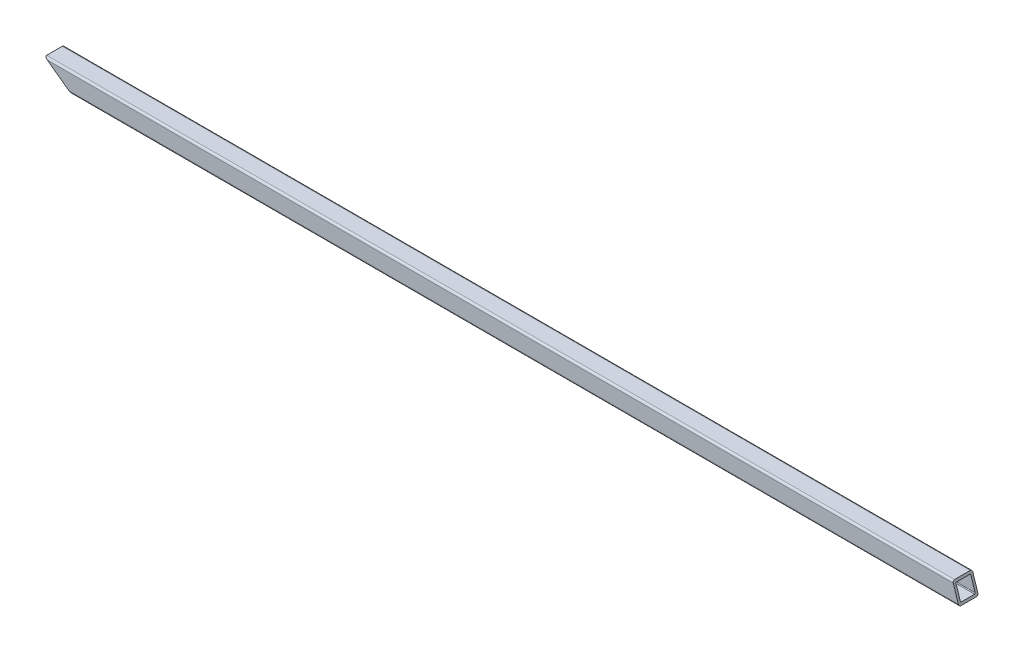
ISO-10303-21;
HEADER;
FILE_DESCRIPTION(('STEP AP214'),'2;1');
FILE_NAME('part.step','',(''),(''),'','','');
FILE_SCHEMA(('AUTOMOTIVE_DESIGN { 1 0 10303 214 1 1 1 1 }'));
ENDSEC;
DATA;
#1=APPLICATION_CONTEXT('core data for automotive mechanical design processes');
#2=APPLICATION_PROTOCOL_DEFINITION('international standard','automotive_design',2000,#1);
#3=PRODUCT_CONTEXT('',#1,'mechanical');
#4=PRODUCT('Part','Part','',(#3));
#5=PRODUCT_RELATED_PRODUCT_CATEGORY('part','',(#4));
#6=PRODUCT_DEFINITION_FORMATION('','',#4);
#7=PRODUCT_DEFINITION_CONTEXT('part definition',#1,'design');
#8=PRODUCT_DEFINITION('design','',#6,#7);
#9=PRODUCT_DEFINITION_SHAPE('','',#8);
#10=(LENGTH_UNIT() NAMED_UNIT(*) SI_UNIT(.MILLI.,.METRE.));
#11=(NAMED_UNIT(*) PLANE_ANGLE_UNIT() SI_UNIT($,.RADIAN.));
#12=(NAMED_UNIT(*) SI_UNIT($,.STERADIAN.) SOLID_ANGLE_UNIT());
#13=UNCERTAINTY_MEASURE_WITH_UNIT(LENGTH_MEASURE(1.E-05),#10,'distance_accuracy_value','');
#14=(GEOMETRIC_REPRESENTATION_CONTEXT(3) GLOBAL_UNCERTAINTY_ASSIGNED_CONTEXT((#13)) GLOBAL_UNIT_ASSIGNED_CONTEXT((#10,
#11,#12)) REPRESENTATION_CONTEXT('',''));
#15=CARTESIAN_POINT('',(0.,0.,0.));
#16=DIRECTION('',(0.,0.,1.));
#17=DIRECTION('',(1.,0.,0.));
#18=AXIS2_PLACEMENT_3D('',#15,#16,#17);
#19=CARTESIAN_POINT('',(-1190.03,12.7,-12.7));
#20=DIRECTION('',(0.,0.,-1.));
#21=DIRECTION('',(0.,1.,0.));
#22=AXIS2_PLACEMENT_3D('',#19,#20,#21);
#23=PLANE('',#22);
#24=DIRECTION('',(-0.309016994374941,0.951056516295156,0.));
#25=VECTOR('',#24,1.);
#26=CARTESIAN_POINT('',(-8.25296028431564,12.7,-12.7));
#27=LINE('',#26,#25);
#28=CARTESIAN_POINT('',(-0.812299240582301,-10.2,-12.7));
#29=VERTEX_POINT('',#28);
#30=CARTESIAN_POINT('',(-7.4406610437334,10.2,-12.7));
#31=VERTEX_POINT('',#30);
#32=EDGE_CURVE('E150',#29,#31,#27,.T.);
#33=ORIENTED_EDGE('',*,*,#32,.F.);
#34=DIRECTION('',(1.,0.,0.));
#35=VECTOR('',#34,1.);
#36=CARTESIAN_POINT('',(-1190.03,-10.2,-12.7));
#37=LINE('',#36,#35);
#38=CARTESIAN_POINT('',(-1158.51085402121,-10.2,-12.7));
#39=VERTEX_POINT('',#38);
#40=EDGE_CURVE('E164',#29,#39,#37,.F.);
#41=ORIENTED_EDGE('',*,*,#40,.T.);
#42=DIRECTION('',(0.809016994374951,-0.587785252292468,0.));
#43=VECTOR('',#42,1.);
#44=CARTESIAN_POINT('',(-1190.03,12.7,-12.7));
#45=LINE('',#44,#43);
#46=CARTESIAN_POINT('',(-1186.58904519882,10.2,-12.7));
#47=VERTEX_POINT('',#46);
#48=EDGE_CURVE('E158',#47,#39,#45,.T.);
#49=ORIENTED_EDGE('',*,*,#48,.F.);
#50=DIRECTION('',(1.,0.,0.));
#51=VECTOR('',#50,1.);
#52=CARTESIAN_POINT('',(-1190.03,10.2,-12.7));
#53=LINE('',#52,#51);
#54=EDGE_CURVE('E167',#47,#31,#53,.T.);
#55=ORIENTED_EDGE('',*,*,#54,.T.);
#56=EDGE_LOOP('',(#33,#41,#49,#55));
#57=FACE_BOUND('',#56,.T.);
#58=ADVANCED_FACE('F37',(#57),#23,.T.);
#59=CARTESIAN_POINT('',(-1190.03,-12.7,12.7));
#60=DIRECTION('',(0.,-1.,0.));
#61=DIRECTION('',(0.,0.,-1.));
#62=AXIS2_PLACEMENT_3D('',#59,#60,#61);
#63=PLANE('',#62);
#64=DIRECTION('',(0.,0.,-1.));
#65=VECTOR('',#64,1.);
#66=CARTESIAN_POINT('',(-1155.06989922003,-12.7,12.7));
#67=LINE('',#66,#65);
#68=CARTESIAN_POINT('',(-1155.06989922003,-12.7,10.2));
#69=VERTEX_POINT('',#68);
#70=CARTESIAN_POINT('',(-1155.06989922003,-12.7,-10.2));
#71=VERTEX_POINT('',#70);
#72=EDGE_CURVE('E244',#69,#71,#67,.T.);
#73=ORIENTED_EDGE('',*,*,#72,.T.);
#74=DIRECTION('',(1.,0.,0.));
#75=VECTOR('',#74,1.);
#76=CARTESIAN_POINT('',(-1190.03,-12.7,-10.2));
#77=LINE('',#76,#75);
#78=CARTESIAN_POINT('',(-1.00180280737661E-13,-12.7,-10.2));
#79=VERTEX_POINT('',#78);
#80=EDGE_CURVE('E181',#71,#79,#77,.T.);
#81=ORIENTED_EDGE('',*,*,#80,.T.);
#82=DIRECTION('',(0.,0.,-1.));
#83=VECTOR('',#82,1.);
#84=CARTESIAN_POINT('',(0.,-12.7,12.7));
#85=LINE('',#84,#83);
#86=CARTESIAN_POINT('',(-1.00180280737661E-13,-12.7,10.2));
#87=VERTEX_POINT('',#86);
#88=EDGE_CURVE('E153',#87,#79,#85,.T.);
#89=ORIENTED_EDGE('',*,*,#88,.F.);
#90=DIRECTION('',(1.,0.,0.));
#91=VECTOR('',#90,1.);
#92=CARTESIAN_POINT('',(-1190.03,-12.7,10.2));
#93=LINE('',#92,#91);
#94=EDGE_CURVE('E268',#87,#69,#93,.F.);
#95=ORIENTED_EDGE('',*,*,#94,.T.);
#96=EDGE_LOOP('',(#73,#81,#89,#95));
#97=FACE_BOUND('',#96,.T.);
#98=ADVANCED_FACE('F274',(#97),#63,.T.);
#99=CARTESIAN_POINT('',(-1190.03,12.7,12.7));
#100=DIRECTION('',(0.,0.,1.));
#101=DIRECTION('',(0.,-1.,0.));
#102=AXIS2_PLACEMENT_3D('',#99,#100,#101);
#103=PLANE('',#102);
#104=DIRECTION('',(-0.309016994374941,0.951056516295156,0.));
#105=VECTOR('',#104,1.);
#106=CARTESIAN_POINT('',(-8.25296028431564,12.7,12.7));
#107=LINE('',#106,#105);
#108=CARTESIAN_POINT('',(-0.812299240582301,-10.2,12.7));
#109=VERTEX_POINT('',#108);
#110=CARTESIAN_POINT('',(-7.44066104373341,10.2,12.7));
#111=VERTEX_POINT('',#110);
#112=EDGE_CURVE('E168',#109,#111,#107,.T.);
#113=ORIENTED_EDGE('',*,*,#112,.T.);
#114=DIRECTION('',(1.,0.,0.));
#115=VECTOR('',#114,1.);
#116=CARTESIAN_POINT('',(-1190.03,10.2,12.7));
#117=LINE('',#116,#115);
#118=CARTESIAN_POINT('',(-1186.58904519882,10.2,12.7));
#119=VERTEX_POINT('',#118);
#120=EDGE_CURVE('E174',#111,#119,#117,.F.);
#121=ORIENTED_EDGE('',*,*,#120,.T.);
#122=DIRECTION('',(0.809016994374951,-0.587785252292468,0.));
#123=VECTOR('',#122,1.);
#124=CARTESIAN_POINT('',(-1190.03,12.7,12.7));
#125=LINE('',#124,#123);
#126=CARTESIAN_POINT('',(-1158.51085402121,-10.2,12.7));
#127=VERTEX_POINT('',#126);
#128=EDGE_CURVE('E278',#119,#127,#125,.T.);
#129=ORIENTED_EDGE('',*,*,#128,.T.);
#130=DIRECTION('',(1.,0.,0.));
#131=VECTOR('',#130,1.);
#132=CARTESIAN_POINT('',(-1190.03,-10.2,12.7));
#133=LINE('',#132,#131);
#134=EDGE_CURVE('E178',#127,#109,#133,.T.);
#135=ORIENTED_EDGE('',*,*,#134,.T.);
#136=EDGE_LOOP('',(#113,#121,#129,#135));
#137=FACE_BOUND('',#136,.T.);
#138=ADVANCED_FACE('F311',(#137),#103,.T.);
#139=CARTESIAN_POINT('',(-1190.03,12.7,12.7));
#140=DIRECTION('',(0.,1.,0.));
#141=DIRECTION('',(0.,0.,1.));
#142=AXIS2_PLACEMENT_3D('',#139,#140,#141);
#143=PLANE('',#142);
#144=DIRECTION('',(0.,0.,-1.));
#145=VECTOR('',#144,1.);
#146=CARTESIAN_POINT('',(-8.25296028431564,12.7,12.7));
#147=LINE('',#146,#145);
#148=CARTESIAN_POINT('',(-8.25296028431555,12.7,10.2));
#149=VERTEX_POINT('',#148);
#150=CARTESIAN_POINT('',(-8.25296028431567,12.7,-10.2));
#151=VERTEX_POINT('',#150);
#152=EDGE_CURVE('E52',#149,#151,#147,.T.);
#153=ORIENTED_EDGE('',*,*,#152,.T.);
#154=DIRECTION('',(1.,0.,0.));
#155=VECTOR('',#154,1.);
#156=CARTESIAN_POINT('',(-1190.03,12.7,-10.2));
#157=LINE('',#156,#155);
#158=CARTESIAN_POINT('',(-1190.03,12.7,-10.2));
#159=VERTEX_POINT('',#158);
#160=EDGE_CURVE('E192',#151,#159,#157,.F.);
#161=ORIENTED_EDGE('',*,*,#160,.T.);
#162=DIRECTION('',(0.,0.,1.));
#163=VECTOR('',#162,1.);
#164=CARTESIAN_POINT('',(-1190.03,12.7,12.7));
#165=LINE('',#164,#163);
#166=CARTESIAN_POINT('',(-1190.03,12.7,10.2));
#167=VERTEX_POINT('',#166);
#168=EDGE_CURVE('E265',#159,#167,#165,.T.);
#169=ORIENTED_EDGE('',*,*,#168,.T.);
#170=DIRECTION('',(1.,0.,0.));
#171=VECTOR('',#170,1.);
#172=CARTESIAN_POINT('',(-1190.03,12.7,10.2));
#173=LINE('',#172,#171);
#174=EDGE_CURVE('E188',#167,#149,#173,.T.);
#175=ORIENTED_EDGE('',*,*,#174,.T.);
#176=EDGE_LOOP('',(#153,#161,#169,#175));
#177=FACE_BOUND('',#176,.T.);
#178=ADVANCED_FACE('F322',(#177),#143,.T.);
#179=CARTESIAN_POINT('',(-1190.03,-9.652,-9.652));
#180=DIRECTION('',(0.,0.,-1.));
#181=DIRECTION('',(-1.,0.,0.));
#182=AXIS2_PLACEMENT_3D('',#179,#180,#181);
#183=PLANE('',#182);
#184=DIRECTION('',(1.,0.,0.));
#185=VECTOR('',#184,1.);
#186=CARTESIAN_POINT('',(0.,-8.652,-9.652));
#187=LINE('',#186,#185);
#188=CARTESIAN_POINT('',(-1160.6414932341,-8.652,-9.652));
#189=VERTEX_POINT('',#188);
#190=CARTESIAN_POINT('',(-1.31527493035066,-8.652,-9.652));
#191=VERTEX_POINT('',#190);
#192=EDGE_CURVE('E198',#189,#191,#187,.T.);
#193=ORIENTED_EDGE('',*,*,#192,.T.);
#194=DIRECTION('',(-0.309016994374941,0.951056516295156,0.));
#195=VECTOR('',#194,1.);
#196=CARTESIAN_POINT('',(-114.53353781648,339.797983792227,-9.652));
#197=LINE('',#196,#195);
#198=CARTESIAN_POINT('',(-6.93768535396481,8.65200000000005,-9.652));
#199=VERTEX_POINT('',#198);
#200=EDGE_CURVE('E291',#191,#199,#197,.T.);
#201=ORIENTED_EDGE('',*,*,#200,.T.);
#202=DIRECTION('',(1.,0.,0.));
#203=VECTOR('',#202,1.);
#204=CARTESIAN_POINT('',(-1190.03,8.652,-9.652));
#205=LINE('',#204,#203);
#206=CARTESIAN_POINT('',(-1184.45840598593,8.652,-9.652));
#207=VERTEX_POINT('',#206);
#208=EDGE_CURVE('E195',#199,#207,#205,.F.);
#209=ORIENTED_EDGE('',*,*,#208,.T.);
#210=DIRECTION('',(0.809016994374951,-0.587785252292468,0.));
#211=VECTOR('',#210,1.);
#212=CARTESIAN_POINT('',(-1179.40099237389,4.97757392913455,-9.652));
#213=LINE('',#212,#211);
#214=EDGE_CURVE('E252',#207,#189,#213,.T.);
#215=ORIENTED_EDGE('',*,*,#214,.T.);
#216=EDGE_LOOP('',(#193,#201,#209,#215));
#217=FACE_BOUND('',#216,.T.);
#218=ADVANCED_FACE('F361',(#217),#183,.F.);
#219=CARTESIAN_POINT('',(-1190.03,-9.652,9.652));
#220=DIRECTION('',(0.,-1.,0.));
#221=DIRECTION('',(0.,0.,-1.));
#222=AXIS2_PLACEMENT_3D('',#219,#220,#221);
#223=PLANE('',#222);
#224=DIRECTION('',(1.,0.,0.));
#225=VECTOR('',#224,1.);
#226=CARTESIAN_POINT('',(0.,-9.652,8.652));
#227=LINE('',#226,#225);
#228=CARTESIAN_POINT('',(-1159.26511131363,-9.652,8.652));
#229=VERTEX_POINT('',#228);
#230=CARTESIAN_POINT('',(-0.990355234117763,-9.652,8.652));
#231=VERTEX_POINT('',#230);
#232=EDGE_CURVE('E202',#229,#231,#227,.T.);
#233=ORIENTED_EDGE('',*,*,#232,.T.);
#234=DIRECTION('',(0.,0.,-1.));
#235=VECTOR('',#234,1.);
#236=CARTESIAN_POINT('',(-0.990355234117946,-9.652,9.65200000000005));
#237=LINE('',#236,#235);
#238=CARTESIAN_POINT('',(-0.990355234117945,-9.652,-8.652));
#239=VERTEX_POINT('',#238);
#240=EDGE_CURVE('E60',#231,#239,#237,.T.);
#241=ORIENTED_EDGE('',*,*,#240,.T.);
#242=DIRECTION('',(1.,0.,0.));
#243=VECTOR('',#242,1.);
#244=CARTESIAN_POINT('',(-1190.03,-9.652,-8.652));
#245=LINE('',#244,#243);
#246=CARTESIAN_POINT('',(-1159.26511131363,-9.652,-8.652));
#247=VERTEX_POINT('',#246);
#248=EDGE_CURVE('E206',#239,#247,#245,.F.);
#249=ORIENTED_EDGE('',*,*,#248,.T.);
#250=DIRECTION('',(0.,0.,1.));
#251=VECTOR('',#250,1.);
#252=CARTESIAN_POINT('',(-1159.26511131363,-9.652,9.652));
#253=LINE('',#252,#251);
#254=EDGE_CURVE('E232',#247,#229,#253,.T.);
#255=ORIENTED_EDGE('',*,*,#254,.T.);
#256=EDGE_LOOP('',(#233,#241,#249,#255));
#257=FACE_BOUND('',#256,.T.);
#258=ADVANCED_FACE('F237',(#257),#223,.F.);
#259=CARTESIAN_POINT('',(-1190.03,-9.652,9.652));
#260=DIRECTION('',(0.,0.,1.));
#261=DIRECTION('',(1.,0.,0.));
#262=AXIS2_PLACEMENT_3D('',#259,#260,#261);
#263=PLANE('',#262);
#264=DIRECTION('',(1.,0.,0.));
#265=VECTOR('',#264,1.);
#266=CARTESIAN_POINT('',(0.,8.652,9.652));
#267=LINE('',#266,#265);
#268=CARTESIAN_POINT('',(-1184.45840598593,8.652,9.652));
#269=VERTEX_POINT('',#268);
#270=CARTESIAN_POINT('',(-6.93768535396481,8.65200000000005,9.652));
#271=VERTEX_POINT('',#270);
#272=EDGE_CURVE('E219',#269,#271,#267,.T.);
#273=ORIENTED_EDGE('',*,*,#272,.T.);
#274=DIRECTION('',(0.309016994374941,-0.951056516295156,0.));
#275=VECTOR('',#274,1.);
#276=CARTESIAN_POINT('',(-114.53353781648,339.797983792227,9.652));
#277=LINE('',#276,#275);
#278=CARTESIAN_POINT('',(-1.31527493035066,-8.652,9.652));
#279=VERTEX_POINT('',#278);
#280=EDGE_CURVE('E304',#271,#279,#277,.T.);
#281=ORIENTED_EDGE('',*,*,#280,.T.);
#282=DIRECTION('',(1.,0.,0.));
#283=VECTOR('',#282,1.);
#284=CARTESIAN_POINT('',(-1190.03,-8.652,9.652));
#285=LINE('',#284,#283);
#286=CARTESIAN_POINT('',(-1160.6414932341,-8.652,9.652));
#287=VERTEX_POINT('',#286);
#288=EDGE_CURVE('E216',#279,#287,#285,.F.);
#289=ORIENTED_EDGE('',*,*,#288,.T.);
#290=DIRECTION('',(-0.809016994374951,0.587785252292468,0.));
#291=VECTOR('',#290,1.);
#292=CARTESIAN_POINT('',(-1179.40099237389,4.97757392913454,9.652));
#293=LINE('',#292,#291);
#294=EDGE_CURVE('E235',#287,#269,#293,.T.);
#295=ORIENTED_EDGE('',*,*,#294,.T.);
#296=EDGE_LOOP('',(#273,#281,#289,#295));
#297=FACE_BOUND('',#296,.T.);
#298=ADVANCED_FACE('F351',(#297),#263,.F.);
#299=CARTESIAN_POINT('',(-1190.03,9.652,9.652));
#300=DIRECTION('',(0.,1.,0.));
#301=DIRECTION('',(0.,0.,1.));
#302=AXIS2_PLACEMENT_3D('',#299,#300,#301);
#303=PLANE('',#302);
#304=DIRECTION('',(1.,0.,0.));
#305=VECTOR('',#304,1.);
#306=CARTESIAN_POINT('',(0.,9.652,-8.652));
#307=LINE('',#306,#305);
#308=CARTESIAN_POINT('',(-1185.8347879064,9.652,-8.652));
#309=VERTEX_POINT('',#308);
#310=CARTESIAN_POINT('',(-7.26260505019782,9.652,-8.652));
#311=VERTEX_POINT('',#310);
#312=EDGE_CURVE('E212',#309,#311,#307,.T.);
#313=ORIENTED_EDGE('',*,*,#312,.T.);
#314=DIRECTION('',(0.,0.,1.));
#315=VECTOR('',#314,1.);
#316=CARTESIAN_POINT('',(-7.26260505019782,9.652,9.65200000000005));
#317=LINE('',#316,#315);
#318=CARTESIAN_POINT('',(-7.2626050501976,9.652,8.652));
#319=VERTEX_POINT('',#318);
#320=EDGE_CURVE('E294',#311,#319,#317,.T.);
#321=ORIENTED_EDGE('',*,*,#320,.T.);
#322=DIRECTION('',(1.,0.,0.));
#323=VECTOR('',#322,1.);
#324=CARTESIAN_POINT('',(-1190.03,9.652,8.652));
#325=LINE('',#324,#323);
#326=CARTESIAN_POINT('',(-1185.8347879064,9.652,8.652));
#327=VERTEX_POINT('',#326);
#328=EDGE_CURVE('E209',#319,#327,#325,.F.);
#329=ORIENTED_EDGE('',*,*,#328,.T.);
#330=DIRECTION('',(0.,0.,-1.));
#331=VECTOR('',#330,1.);
#332=CARTESIAN_POINT('',(-1185.8347879064,9.652,9.652));
#333=LINE('',#332,#331);
#334=EDGE_CURVE('E249',#327,#309,#333,.T.);
#335=ORIENTED_EDGE('',*,*,#334,.T.);
#336=EDGE_LOOP('',(#313,#321,#329,#335));
#337=FACE_BOUND('',#336,.T.);
#338=ADVANCED_FACE('F347',(#337),#303,.F.);
#339=CARTESIAN_POINT('',(-1190.03,-10.2,-10.2));
#340=DIRECTION('',(1.,0.,0.));
#341=DIRECTION('',(0.,0.,-1.));
#342=AXIS2_PLACEMENT_3D('',#339,#340,#341);
#343=CYLINDRICAL_SURFACE('',#342,2.5);
#344=CARTESIAN_POINT('',(-0.812299240582348,-10.2,-10.2));
#345=DIRECTION('',(-0.951056516295156,-0.309016994374941,0.));
#346=DIRECTION('',(0.309016994374941,-0.951056516295156,0.));
#347=AXIS2_PLACEMENT_3D('',#344,#345,#346);
#348=ELLIPSE('',#347,2.62865556059566,2.5);
#349=EDGE_CURVE('E147',#79,#29,#348,.F.);
#350=ORIENTED_EDGE('',*,*,#349,.F.);
#351=ORIENTED_EDGE('',*,*,#80,.F.);
#352=CARTESIAN_POINT('',(-1158.51085402121,-10.2,-10.2));
#353=DIRECTION('',(0.587785252292468,0.809016994374951,0.));
#354=DIRECTION('',(0.809016994374951,-0.587785252292468,0.));
#355=AXIS2_PLACEMENT_3D('',#352,#353,#354);
#356=ELLIPSE('',#355,4.25325404176023,2.5);
#357=EDGE_CURVE('E172',#39,#71,#356,.F.);
#358=ORIENTED_EDGE('',*,*,#357,.F.);
#359=ORIENTED_EDGE('',*,*,#40,.F.);
#360=EDGE_LOOP('',(#350,#351,#358,#359));
#361=FACE_BOUND('',#360,.T.);
#362=ADVANCED_FACE('F171',(#361),#343,.T.);
#363=CARTESIAN_POINT('',(-1190.03,-10.2,10.2));
#364=DIRECTION('',(1.,0.,0.));
#365=DIRECTION('',(0.,0.,-1.));
#366=AXIS2_PLACEMENT_3D('',#363,#364,#365);
#367=CYLINDRICAL_SURFACE('',#366,2.5);
#368=CARTESIAN_POINT('',(-0.812299240582348,-10.2,10.2));
#369=DIRECTION('',(-0.951056516295156,-0.309016994374941,0.));
#370=DIRECTION('',(0.309016994374941,-0.951056516295156,0.));
#371=AXIS2_PLACEMENT_3D('',#368,#369,#370);
#372=ELLIPSE('',#371,2.62865556059566,2.5);
#373=EDGE_CURVE('E159',#109,#87,#372,.F.);
#374=ORIENTED_EDGE('',*,*,#373,.F.);
#375=ORIENTED_EDGE('',*,*,#134,.F.);
#376=CARTESIAN_POINT('',(-1158.51085402121,-10.2,10.2));
#377=DIRECTION('',(0.587785252292468,0.809016994374951,0.));
#378=DIRECTION('',(0.809016994374951,-0.587785252292468,0.));
#379=AXIS2_PLACEMENT_3D('',#376,#377,#378);
#380=ELLIPSE('',#379,4.25325404176023,2.5);
#381=EDGE_CURVE('E262',#69,#127,#380,.F.);
#382=ORIENTED_EDGE('',*,*,#381,.F.);
#383=ORIENTED_EDGE('',*,*,#94,.F.);
#384=EDGE_LOOP('',(#374,#375,#382,#383));
#385=FACE_BOUND('',#384,.T.);
#386=ADVANCED_FACE('F327',(#385),#367,.T.);
#387=CARTESIAN_POINT('',(-1190.03,10.2,-10.2));
#388=DIRECTION('',(1.,0.,0.));
#389=DIRECTION('',(0.,0.,-1.));
#390=AXIS2_PLACEMENT_3D('',#387,#388,#389);
#391=CYLINDRICAL_SURFACE('',#390,2.5);
#392=CARTESIAN_POINT('',(-7.44066104373342,10.2,-10.2));
#393=DIRECTION('',(-0.951056516295156,-0.309016994374941,0.));
#394=DIRECTION('',(0.309016994374941,-0.951056516295156,0.));
#395=AXIS2_PLACEMENT_3D('',#392,#393,#394);
#396=ELLIPSE('',#395,2.62865556059566,2.5);
#397=EDGE_CURVE('E284',#31,#151,#396,.F.);
#398=ORIENTED_EDGE('',*,*,#397,.F.);
#399=ORIENTED_EDGE('',*,*,#54,.F.);
#400=CARTESIAN_POINT('',(-1186.58904519882,10.2,-10.2));
#401=DIRECTION('',(0.587785252292468,0.809016994374951,0.));
#402=DIRECTION('',(0.809016994374951,-0.587785252292468,0.));
#403=AXIS2_PLACEMENT_3D('',#400,#401,#402);
#404=ELLIPSE('',#403,4.25325404176023,2.5);
#405=EDGE_CURVE('E260',#159,#47,#404,.F.);
#406=ORIENTED_EDGE('',*,*,#405,.F.);
#407=ORIENTED_EDGE('',*,*,#160,.F.);
#408=EDGE_LOOP('',(#398,#399,#406,#407));
#409=FACE_BOUND('',#408,.T.);
#410=ADVANCED_FACE('F325',(#409),#391,.T.);
#411=CARTESIAN_POINT('',(-1190.03,10.2,10.2));
#412=DIRECTION('',(1.,0.,0.));
#413=DIRECTION('',(0.,0.,-1.));
#414=AXIS2_PLACEMENT_3D('',#411,#412,#413);
#415=CYLINDRICAL_SURFACE('',#414,2.5);
#416=CARTESIAN_POINT('',(-7.44066104373342,10.2,10.2));
#417=DIRECTION('',(-0.951056516295156,-0.309016994374941,0.));
#418=DIRECTION('',(0.309016994374941,-0.951056516295156,0.));
#419=AXIS2_PLACEMENT_3D('',#416,#417,#418);
#420=ELLIPSE('',#419,2.62865556059566,2.5);
#421=EDGE_CURVE('E286',#149,#111,#420,.F.);
#422=ORIENTED_EDGE('',*,*,#421,.F.);
#423=ORIENTED_EDGE('',*,*,#174,.F.);
#424=CARTESIAN_POINT('',(-1186.58904519882,10.2,10.2));
#425=DIRECTION('',(0.587785252292468,0.809016994374951,0.));
#426=DIRECTION('',(0.809016994374951,-0.587785252292468,0.));
#427=AXIS2_PLACEMENT_3D('',#424,#425,#426);
#428=ELLIPSE('',#427,4.25325404176023,2.5);
#429=EDGE_CURVE('E258',#119,#167,#428,.F.);
#430=ORIENTED_EDGE('',*,*,#429,.F.);
#431=ORIENTED_EDGE('',*,*,#120,.F.);
#432=EDGE_LOOP('',(#422,#423,#430,#431));
#433=FACE_BOUND('',#432,.T.);
#434=ADVANCED_FACE('F317',(#433),#415,.T.);
#435=CARTESIAN_POINT('',(-1190.03,-8.652,-8.652));
#436=DIRECTION('',(-1.,0.,0.));
#437=DIRECTION('',(0.,0.,1.));
#438=AXIS2_PLACEMENT_3D('',#435,#436,#437);
#439=CYLINDRICAL_SURFACE('',#438,1.);
#440=ORIENTED_EDGE('',*,*,#248,.F.);
#441=CARTESIAN_POINT('',(-1.31527493035066,-8.652,-8.652));
#442=DIRECTION('',(-0.951056516295156,-0.309016994374941,0.));
#443=DIRECTION('',(-0.309016994374941,0.951056516295156,0.));
#444=AXIS2_PLACEMENT_3D('',#441,#442,#443);
#445=ELLIPSE('',#444,1.05146222423827,1.);
#446=EDGE_CURVE('E297',#239,#191,#445,.F.);
#447=ORIENTED_EDGE('',*,*,#446,.T.);
#448=ORIENTED_EDGE('',*,*,#192,.F.);
#449=CARTESIAN_POINT('',(-1160.6414932341,-8.652,-8.652));
#450=DIRECTION('',(0.587785252292468,0.809016994374951,0.));
#451=DIRECTION('',(-0.809016994374951,0.587785252292468,0.));
#452=AXIS2_PLACEMENT_3D('',#449,#450,#451);
#453=ELLIPSE('',#452,1.70130161670409,1.);
#454=EDGE_CURVE('E242',#189,#247,#453,.F.);
#455=ORIENTED_EDGE('',*,*,#454,.T.);
#456=EDGE_LOOP('',(#440,#447,#448,#455));
#457=FACE_BOUND('',#456,.T.);
#458=ADVANCED_FACE('F333',(#457),#439,.F.);
#459=CARTESIAN_POINT('',(-1190.03,8.652,-8.652));
#460=DIRECTION('',(-1.,0.,0.));
#461=DIRECTION('',(0.,0.,1.));
#462=AXIS2_PLACEMENT_3D('',#459,#460,#461);
#463=CYLINDRICAL_SURFACE('',#462,1.);
#464=ORIENTED_EDGE('',*,*,#208,.F.);
#465=CARTESIAN_POINT('',(-6.93768535396488,8.652,-8.652));
#466=DIRECTION('',(-0.951056516295156,-0.309016994374941,0.));
#467=DIRECTION('',(-0.309016994374941,0.951056516295156,0.));
#468=AXIS2_PLACEMENT_3D('',#465,#466,#467);
#469=ELLIPSE('',#468,1.05146222423827,1.);
#470=EDGE_CURVE('E288',#199,#311,#469,.F.);
#471=ORIENTED_EDGE('',*,*,#470,.T.);
#472=ORIENTED_EDGE('',*,*,#312,.F.);
#473=CARTESIAN_POINT('',(-1184.45840598593,8.652,-8.652));
#474=DIRECTION('',(0.587785252292468,0.809016994374951,0.));
#475=DIRECTION('',(-0.809016994374951,0.587785252292468,0.));
#476=AXIS2_PLACEMENT_3D('',#473,#474,#475);
#477=ELLIPSE('',#476,1.70130161670409,1.);
#478=EDGE_CURVE('E255',#309,#207,#477,.F.);
#479=ORIENTED_EDGE('',*,*,#478,.T.);
#480=EDGE_LOOP('',(#464,#471,#472,#479));
#481=FACE_BOUND('',#480,.T.);
#482=ADVANCED_FACE('F405',(#481),#463,.F.);
#483=CARTESIAN_POINT('',(-1190.03,8.652,8.652));
#484=DIRECTION('',(-1.,0.,0.));
#485=DIRECTION('',(0.,0.,1.));
#486=AXIS2_PLACEMENT_3D('',#483,#484,#485);
#487=CYLINDRICAL_SURFACE('',#486,1.);
#488=ORIENTED_EDGE('',*,*,#328,.F.);
#489=CARTESIAN_POINT('',(-6.93768535396488,8.652,8.652));
#490=DIRECTION('',(-0.951056516295156,-0.309016994374941,0.));
#491=DIRECTION('',(-0.309016994374941,0.951056516295156,0.));
#492=AXIS2_PLACEMENT_3D('',#489,#490,#491);
#493=ELLIPSE('',#492,1.05146222423827,1.);
#494=EDGE_CURVE('E300',#319,#271,#493,.F.);
#495=ORIENTED_EDGE('',*,*,#494,.T.);
#496=ORIENTED_EDGE('',*,*,#272,.F.);
#497=CARTESIAN_POINT('',(-1184.45840598593,8.652,8.652));
#498=DIRECTION('',(0.587785252292468,0.809016994374951,0.));
#499=DIRECTION('',(-0.809016994374951,0.587785252292468,0.));
#500=AXIS2_PLACEMENT_3D('',#497,#498,#499);
#501=ELLIPSE('',#500,1.70130161670409,1.);
#502=EDGE_CURVE('E239',#269,#327,#501,.F.);
#503=ORIENTED_EDGE('',*,*,#502,.T.);
#504=EDGE_LOOP('',(#488,#495,#496,#503));
#505=FACE_BOUND('',#504,.T.);
#506=ADVANCED_FACE('F402',(#505),#487,.F.);
#507=CARTESIAN_POINT('',(-1190.03,-8.652,8.652));
#508=DIRECTION('',(-1.,0.,0.));
#509=DIRECTION('',(0.,0.,1.));
#510=AXIS2_PLACEMENT_3D('',#507,#508,#509);
#511=CYLINDRICAL_SURFACE('',#510,1.);
#512=ORIENTED_EDGE('',*,*,#288,.F.);
#513=CARTESIAN_POINT('',(-1.31527493035066,-8.652,8.652));
#514=DIRECTION('',(-0.951056516295156,-0.309016994374941,0.));
#515=DIRECTION('',(-0.309016994374941,0.951056516295156,0.));
#516=AXIS2_PLACEMENT_3D('',#513,#514,#515);
#517=ELLIPSE('',#516,1.05146222423827,1.);
#518=EDGE_CURVE('E11',#279,#231,#517,.F.);
#519=ORIENTED_EDGE('',*,*,#518,.T.);
#520=ORIENTED_EDGE('',*,*,#232,.F.);
#521=CARTESIAN_POINT('',(-1160.6414932341,-8.652,8.652));
#522=DIRECTION('',(0.587785252292468,0.809016994374951,0.));
#523=DIRECTION('',(-0.809016994374951,0.587785252292468,0.));
#524=AXIS2_PLACEMENT_3D('',#521,#522,#523);
#525=ELLIPSE('',#524,1.70130161670409,1.);
#526=EDGE_CURVE('E45',#229,#287,#525,.F.);
#527=ORIENTED_EDGE('',*,*,#526,.T.);
#528=EDGE_LOOP('',(#512,#519,#520,#527));
#529=FACE_BOUND('',#528,.T.);
#530=ADVANCED_FACE('F39',(#529),#511,.F.);
#531=CARTESIAN_POINT('',(-1190.03,12.7,12.7));
#532=DIRECTION('',(0.587785252292468,0.809016994374951,0.));
#533=DIRECTION('',(-0.809016994374951,0.587785252292468,0.));
#534=AXIS2_PLACEMENT_3D('',#531,#532,#533);
#535=PLANE('',#534);
#536=ORIENTED_EDGE('',*,*,#357,.T.);
#537=ORIENTED_EDGE('',*,*,#72,.F.);
#538=ORIENTED_EDGE('',*,*,#381,.T.);
#539=ORIENTED_EDGE('',*,*,#128,.F.);
#540=ORIENTED_EDGE('',*,*,#429,.T.);
#541=ORIENTED_EDGE('',*,*,#168,.F.);
#542=ORIENTED_EDGE('',*,*,#405,.T.);
#543=ORIENTED_EDGE('',*,*,#48,.T.);
#544=EDGE_LOOP('',(#536,#537,#538,#539,#540,#541,#542,#543));
#545=FACE_BOUND('',#544,.T.);
#546=ORIENTED_EDGE('',*,*,#334,.F.);
#547=ORIENTED_EDGE('',*,*,#502,.F.);
#548=ORIENTED_EDGE('',*,*,#294,.F.);
#549=ORIENTED_EDGE('',*,*,#526,.F.);
#550=ORIENTED_EDGE('',*,*,#254,.F.);
#551=ORIENTED_EDGE('',*,*,#454,.F.);
#552=ORIENTED_EDGE('',*,*,#214,.F.);
#553=ORIENTED_EDGE('',*,*,#478,.F.);
#554=EDGE_LOOP('',(#546,#547,#548,#549,#550,#551,#552,#553));
#555=FACE_BOUND('',#554,.T.);
#556=ADVANCED_FACE('F231',(#545,#555),#535,.F.);
#557=CARTESIAN_POINT('',(-8.25296028431564,12.7,12.7));
#558=DIRECTION('',(-0.951056516295156,-0.309016994374941,0.));
#559=DIRECTION('',(0.309016994374941,-0.951056516295156,0.));
#560=AXIS2_PLACEMENT_3D('',#557,#558,#559);
#561=PLANE('',#560);
#562=ORIENTED_EDGE('',*,*,#349,.T.);
#563=ORIENTED_EDGE('',*,*,#32,.T.);
#564=ORIENTED_EDGE('',*,*,#397,.T.);
#565=ORIENTED_EDGE('',*,*,#152,.F.);
#566=ORIENTED_EDGE('',*,*,#421,.T.);
#567=ORIENTED_EDGE('',*,*,#112,.F.);
#568=ORIENTED_EDGE('',*,*,#373,.T.);
#569=ORIENTED_EDGE('',*,*,#88,.T.);
#570=EDGE_LOOP('',(#562,#563,#564,#565,#566,#567,#568,#569));
#571=FACE_BOUND('',#570,.T.);
#572=ORIENTED_EDGE('',*,*,#200,.F.);
#573=ORIENTED_EDGE('',*,*,#446,.F.);
#574=ORIENTED_EDGE('',*,*,#240,.F.);
#575=ORIENTED_EDGE('',*,*,#518,.F.);
#576=ORIENTED_EDGE('',*,*,#280,.F.);
#577=ORIENTED_EDGE('',*,*,#494,.F.);
#578=ORIENTED_EDGE('',*,*,#320,.F.);
#579=ORIENTED_EDGE('',*,*,#470,.F.);
#580=EDGE_LOOP('',(#572,#573,#574,#575,#576,#577,#578,#579));
#581=FACE_BOUND('',#580,.T.);
#582=ADVANCED_FACE('F149',(#571,#581),#561,.F.);
#583=CLOSED_SHELL('',(#58,#98,#138,#178,#218,#258,#298,#338,#362,#386,#410,#434,#458,#482,#506,
#530,#556,#582));
#584=MANIFOLD_SOLID_BREP('B2',#583);
#585=ADVANCED_BREP_SHAPE_REPRESENTATION('',(#18,#584),#14);
#586=SHAPE_DEFINITION_REPRESENTATION(#9,#585);
ENDSEC;
END-ISO-10303-21;
